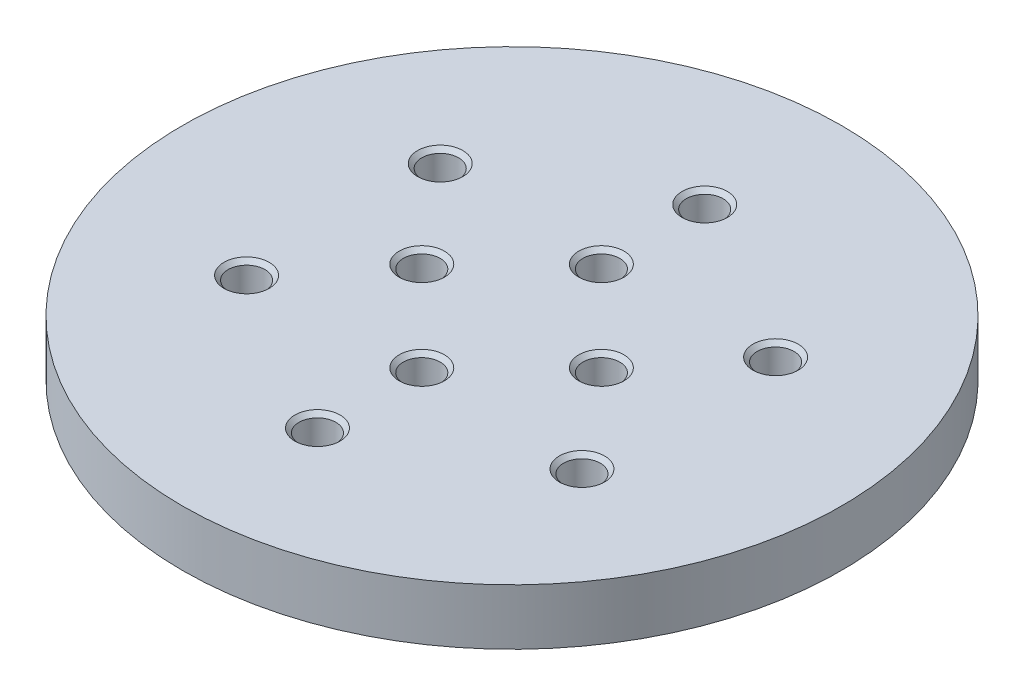
ISO-10303-21;
HEADER;
FILE_DESCRIPTION(('STEP AP214'),'2;1');
FILE_NAME('part.step','',(''),(''),'','','');
FILE_SCHEMA(('AUTOMOTIVE_DESIGN { 1 0 10303 214 1 1 1 1 }'));
ENDSEC;
DATA;
#1=APPLICATION_CONTEXT('core data for automotive mechanical design processes');
#2=APPLICATION_PROTOCOL_DEFINITION('international standard','automotive_design',2000,#1);
#3=PRODUCT_CONTEXT('',#1,'mechanical');
#4=PRODUCT('Part','Part','',(#3));
#5=PRODUCT_RELATED_PRODUCT_CATEGORY('part','',(#4));
#6=PRODUCT_DEFINITION_FORMATION('','',#4);
#7=PRODUCT_DEFINITION_CONTEXT('part definition',#1,'design');
#8=PRODUCT_DEFINITION('design','',#6,#7);
#9=PRODUCT_DEFINITION_SHAPE('','',#8);
#10=(LENGTH_UNIT() NAMED_UNIT(*) SI_UNIT(.MILLI.,.METRE.));
#11=(NAMED_UNIT(*) PLANE_ANGLE_UNIT() SI_UNIT($,.RADIAN.));
#12=(NAMED_UNIT(*) SI_UNIT($,.STERADIAN.) SOLID_ANGLE_UNIT());
#13=UNCERTAINTY_MEASURE_WITH_UNIT(LENGTH_MEASURE(1.E-05),#10,'distance_accuracy_value','');
#14=(GEOMETRIC_REPRESENTATION_CONTEXT(3) GLOBAL_UNCERTAINTY_ASSIGNED_CONTEXT((#13)) GLOBAL_UNIT_ASSIGNED_CONTEXT((#10,
#11,#12)) REPRESENTATION_CONTEXT('',''));
#15=CARTESIAN_POINT('',(0.,0.,0.));
#16=DIRECTION('',(0.,0.,1.));
#17=DIRECTION('',(1.,0.,0.));
#18=AXIS2_PLACEMENT_3D('',#15,#16,#17);
#19=CARTESIAN_POINT('',(0.,5.,0.));
#20=DIRECTION('',(0.,-1.,0.));
#21=DIRECTION('',(0.,0.,-1.));
#22=AXIS2_PLACEMENT_3D('',#19,#20,#21);
#23=CYLINDRICAL_SURFACE('',#22,29.5);
#24=CARTESIAN_POINT('',(0.,5.,0.));
#25=DIRECTION('',(0.,1.,0.));
#26=DIRECTION('',(0.,0.,1.));
#27=AXIS2_PLACEMENT_3D('',#24,#25,#26);
#28=CIRCLE('',#27,29.5);
#29=CARTESIAN_POINT('',(0.,5.,29.5));
#30=VERTEX_POINT('',#29);
#31=EDGE_CURVE('E10',#30,#30,#28,.T.);
#32=ORIENTED_EDGE('',*,*,#31,.F.);
#33=EDGE_LOOP('',(#32));
#34=FACE_BOUND('',#33,.T.);
#35=CARTESIAN_POINT('',(0.,0.,0.));
#36=DIRECTION('',(0.,1.,0.));
#37=DIRECTION('',(0.,0.,1.));
#38=AXIS2_PLACEMENT_3D('',#35,#36,#37);
#39=CIRCLE('',#38,29.5);
#40=CARTESIAN_POINT('',(0.,0.,29.5));
#41=VERTEX_POINT('',#40);
#42=EDGE_CURVE('E50',#41,#41,#39,.T.);
#43=ORIENTED_EDGE('',*,*,#42,.T.);
#44=EDGE_LOOP('',(#43));
#45=FACE_BOUND('',#44,.T.);
#46=ADVANCED_FACE('F43',(#34,#45),#23,.T.);
#47=CARTESIAN_POINT('',(0.,5.,0.));
#48=DIRECTION('',(0.,1.,0.));
#49=DIRECTION('',(0.,0.,1.));
#50=AXIS2_PLACEMENT_3D('',#47,#48,#49);
#51=PLANE('',#50);
#52=CARTESIAN_POINT('',(15.010395937938,5.,-8.58374386458872));
#53=DIRECTION('',(0.,1.,0.));
#54=DIRECTION('',(0.,0.,1.));
#55=AXIS2_PLACEMENT_3D('',#52,#53,#54);
#56=CIRCLE('',#55,2.025);
#57=CARTESIAN_POINT('',(15.010395937938,5.,-6.55874386458872));
#58=VERTEX_POINT('',#57);
#59=EDGE_CURVE('E276',#58,#58,#56,.T.);
#60=ORIENTED_EDGE('',*,*,#59,.F.);
#61=EDGE_LOOP('',(#60));
#62=FACE_BOUND('',#61,.T.);
#63=CARTESIAN_POINT('',(15.0103959379382,5.,8.74876840623421));
#64=DIRECTION('',(0.,1.,0.));
#65=DIRECTION('',(0.,0.,1.));
#66=AXIS2_PLACEMENT_3D('',#63,#64,#65);
#67=CIRCLE('',#66,2.025);
#68=CARTESIAN_POINT('',(15.0103959379382,5.,10.7737684062342));
#69=VERTEX_POINT('',#68);
#70=EDGE_CURVE('E106',#69,#69,#67,.T.);
#71=ORIENTED_EDGE('',*,*,#70,.F.);
#72=EDGE_LOOP('',(#71));
#73=FACE_BOUND('',#72,.T.);
#74=CARTESIAN_POINT('',(0.,5.,17.4150245416458));
#75=DIRECTION('',(0.,1.,0.));
#76=DIRECTION('',(0.,0.,1.));
#77=AXIS2_PLACEMENT_3D('',#74,#75,#76);
#78=CIRCLE('',#77,2.025);
#79=CARTESIAN_POINT('',(0.,5.,19.4400245416458));
#80=VERTEX_POINT('',#79);
#81=EDGE_CURVE('E99',#80,#80,#78,.T.);
#82=ORIENTED_EDGE('',*,*,#81,.F.);
#83=EDGE_LOOP('',(#82));
#84=FACE_BOUND('',#83,.T.);
#85=CARTESIAN_POINT('',(-15.0103959379381,5.,8.74876840623443));
#86=DIRECTION('',(0.,1.,0.));
#87=DIRECTION('',(0.,0.,1.));
#88=AXIS2_PLACEMENT_3D('',#85,#86,#87);
#89=CIRCLE('',#88,2.025);
#90=CARTESIAN_POINT('',(-15.0103959379381,5.,10.7737684062344));
#91=VERTEX_POINT('',#90);
#92=EDGE_CURVE('E95',#91,#91,#89,.T.);
#93=ORIENTED_EDGE('',*,*,#92,.F.);
#94=EDGE_LOOP('',(#93));
#95=FACE_BOUND('',#94,.T.);
#96=CARTESIAN_POINT('',(-15.0103959379382,5.,-8.58374386458851));
#97=DIRECTION('',(0.,1.,0.));
#98=DIRECTION('',(0.,0.,1.));
#99=AXIS2_PLACEMENT_3D('',#96,#97,#98);
#100=CIRCLE('',#99,2.025);
#101=CARTESIAN_POINT('',(-15.0103959379382,5.,-6.55874386458852));
#102=VERTEX_POINT('',#101);
#103=EDGE_CURVE('E91',#102,#102,#100,.T.);
#104=ORIENTED_EDGE('',*,*,#103,.F.);
#105=EDGE_LOOP('',(#104));
#106=FACE_BOUND('',#105,.T.);
#107=CARTESIAN_POINT('',(0.,5.,-17.25));
#108=DIRECTION('',(0.,1.,0.));
#109=DIRECTION('',(0.,0.,1.));
#110=AXIS2_PLACEMENT_3D('',#107,#108,#109);
#111=CIRCLE('',#110,2.025);
#112=CARTESIAN_POINT('',(0.,5.,-15.225));
#113=VERTEX_POINT('',#112);
#114=EDGE_CURVE('E86',#113,#113,#111,.T.);
#115=ORIENTED_EDGE('',*,*,#114,.F.);
#116=EDGE_LOOP('',(#115));
#117=FACE_BOUND('',#116,.T.);
#118=CARTESIAN_POINT('',(8.03787452943668,5.,0.0378745294365963));
#119=DIRECTION('',(0.,1.,0.));
#120=DIRECTION('',(0.,0.,1.));
#121=AXIS2_PLACEMENT_3D('',#118,#119,#120);
#122=CIRCLE('',#121,2.025);
#123=CARTESIAN_POINT('',(8.03787452943668,5.,2.0628745294366));
#124=VERTEX_POINT('',#123);
#125=EDGE_CURVE('E81',#124,#124,#122,.T.);
#126=ORIENTED_EDGE('',*,*,#125,.F.);
#127=EDGE_LOOP('',(#126));
#128=FACE_BOUND('',#127,.T.);
#129=CARTESIAN_POINT('',(0.,5.,8.07574905887336));
#130=DIRECTION('',(0.,1.,0.));
#131=DIRECTION('',(0.,0.,1.));
#132=AXIS2_PLACEMENT_3D('',#129,#130,#131);
#133=CIRCLE('',#132,2.025);
#134=CARTESIAN_POINT('',(0.,5.,10.1007490588734));
#135=VERTEX_POINT('',#134);
#136=EDGE_CURVE('E76',#135,#135,#133,.T.);
#137=ORIENTED_EDGE('',*,*,#136,.F.);
#138=EDGE_LOOP('',(#137));
#139=FACE_BOUND('',#138,.T.);
#140=CARTESIAN_POINT('',(-8.03787452943668,5.,0.0378745294367086));
#141=DIRECTION('',(0.,1.,0.));
#142=DIRECTION('',(0.,0.,1.));
#143=AXIS2_PLACEMENT_3D('',#140,#141,#142);
#144=CIRCLE('',#143,2.025);
#145=CARTESIAN_POINT('',(-8.03787452943668,5.,2.06287452943671));
#146=VERTEX_POINT('',#145);
#147=EDGE_CURVE('E71',#146,#146,#144,.T.);
#148=ORIENTED_EDGE('',*,*,#147,.F.);
#149=EDGE_LOOP('',(#148));
#150=FACE_BOUND('',#149,.T.);
#151=CARTESIAN_POINT('',(0.,5.,-8.));
#152=DIRECTION('',(0.,1.,0.));
#153=DIRECTION('',(0.,0.,1.));
#154=AXIS2_PLACEMENT_3D('',#151,#152,#153);
#155=CIRCLE('',#154,2.025);
#156=CARTESIAN_POINT('',(0.,5.,-5.975));
#157=VERTEX_POINT('',#156);
#158=EDGE_CURVE('E66',#157,#157,#155,.T.);
#159=ORIENTED_EDGE('',*,*,#158,.F.);
#160=EDGE_LOOP('',(#159));
#161=FACE_BOUND('',#160,.T.);
#162=ORIENTED_EDGE('',*,*,#31,.T.);
#163=EDGE_LOOP('',(#162));
#164=FACE_BOUND('',#163,.T.);
#165=ADVANCED_FACE('F164',(#62,#73,#84,#95,#106,#117,#128,#139,#150,#161,#164),#51,.T.);
#166=CARTESIAN_POINT('',(0.,0.,0.));
#167=DIRECTION('',(0.,1.,0.));
#168=DIRECTION('',(0.,0.,1.));
#169=AXIS2_PLACEMENT_3D('',#166,#167,#168);
#170=PLANE('',#169);
#171=CARTESIAN_POINT('',(15.010395937938,0.,-8.58374386458872));
#172=DIRECTION('',(0.,1.,0.));
#173=DIRECTION('',(0.,0.,1.));
#174=AXIS2_PLACEMENT_3D('',#171,#172,#173);
#175=CIRCLE('',#174,1.64999999999999);
#176=CARTESIAN_POINT('',(15.010395937938,0.,-6.93374386458874));
#177=VERTEX_POINT('',#176);
#178=EDGE_CURVE('E46',#177,#177,#175,.T.);
#179=ORIENTED_EDGE('',*,*,#178,.T.);
#180=EDGE_LOOP('',(#179));
#181=FACE_BOUND('',#180,.T.);
#182=CARTESIAN_POINT('',(15.0103959379382,0.,8.74876840623421));
#183=DIRECTION('',(0.,1.,0.));
#184=DIRECTION('',(0.,0.,1.));
#185=AXIS2_PLACEMENT_3D('',#182,#183,#184);
#186=CIRCLE('',#185,1.64999999999999);
#187=CARTESIAN_POINT('',(15.0103959379382,0.,10.3987684062342));
#188=VERTEX_POINT('',#187);
#189=EDGE_CURVE('E97',#188,#188,#186,.T.);
#190=ORIENTED_EDGE('',*,*,#189,.T.);
#191=EDGE_LOOP('',(#190));
#192=FACE_BOUND('',#191,.T.);
#193=CARTESIAN_POINT('',(0.,0.,17.4150245416458));
#194=DIRECTION('',(0.,1.,0.));
#195=DIRECTION('',(0.,0.,1.));
#196=AXIS2_PLACEMENT_3D('',#193,#194,#195);
#197=CIRCLE('',#196,1.64999999999999);
#198=CARTESIAN_POINT('',(0.,0.,19.0650245416458));
#199=VERTEX_POINT('',#198);
#200=EDGE_CURVE('E93',#199,#199,#197,.T.);
#201=ORIENTED_EDGE('',*,*,#200,.T.);
#202=EDGE_LOOP('',(#201));
#203=FACE_BOUND('',#202,.T.);
#204=CARTESIAN_POINT('',(-15.0103959379381,0.,8.74876840623443));
#205=DIRECTION('',(0.,1.,0.));
#206=DIRECTION('',(0.,0.,1.));
#207=AXIS2_PLACEMENT_3D('',#204,#205,#206);
#208=CIRCLE('',#207,1.64999999999999);
#209=CARTESIAN_POINT('',(-15.0103959379381,0.,10.3987684062344));
#210=VERTEX_POINT('',#209);
#211=EDGE_CURVE('E88',#210,#210,#208,.T.);
#212=ORIENTED_EDGE('',*,*,#211,.T.);
#213=EDGE_LOOP('',(#212));
#214=FACE_BOUND('',#213,.T.);
#215=CARTESIAN_POINT('',(-15.0103959379382,0.,-8.58374386458851));
#216=DIRECTION('',(0.,1.,0.));
#217=DIRECTION('',(0.,0.,1.));
#218=AXIS2_PLACEMENT_3D('',#215,#216,#217);
#219=CIRCLE('',#218,1.64999999999999);
#220=CARTESIAN_POINT('',(-15.0103959379382,0.,-6.93374386458853));
#221=VERTEX_POINT('',#220);
#222=EDGE_CURVE('E83',#221,#221,#219,.T.);
#223=ORIENTED_EDGE('',*,*,#222,.T.);
#224=EDGE_LOOP('',(#223));
#225=FACE_BOUND('',#224,.T.);
#226=CARTESIAN_POINT('',(0.,0.,-17.25));
#227=DIRECTION('',(0.,1.,0.));
#228=DIRECTION('',(0.,0.,1.));
#229=AXIS2_PLACEMENT_3D('',#226,#227,#228);
#230=CIRCLE('',#229,1.64999999999999);
#231=CARTESIAN_POINT('',(0.,0.,-15.6));
#232=VERTEX_POINT('',#231);
#233=EDGE_CURVE('E78',#232,#232,#230,.T.);
#234=ORIENTED_EDGE('',*,*,#233,.T.);
#235=EDGE_LOOP('',(#234));
#236=FACE_BOUND('',#235,.T.);
#237=CARTESIAN_POINT('',(8.03787452943668,0.,0.0378745294365963));
#238=DIRECTION('',(0.,1.,0.));
#239=DIRECTION('',(0.,0.,1.));
#240=AXIS2_PLACEMENT_3D('',#237,#238,#239);
#241=CIRCLE('',#240,1.64999999999999);
#242=CARTESIAN_POINT('',(8.03787452943668,0.,1.68787452943659));
#243=VERTEX_POINT('',#242);
#244=EDGE_CURVE('E73',#243,#243,#241,.T.);
#245=ORIENTED_EDGE('',*,*,#244,.T.);
#246=EDGE_LOOP('',(#245));
#247=FACE_BOUND('',#246,.T.);
#248=CARTESIAN_POINT('',(0.,0.,8.07574905887336));
#249=DIRECTION('',(0.,1.,0.));
#250=DIRECTION('',(0.,0.,1.));
#251=AXIS2_PLACEMENT_3D('',#248,#249,#250);
#252=CIRCLE('',#251,1.64999999999999);
#253=CARTESIAN_POINT('',(0.,0.,9.72574905887335));
#254=VERTEX_POINT('',#253);
#255=EDGE_CURVE('E68',#254,#254,#252,.T.);
#256=ORIENTED_EDGE('',*,*,#255,.T.);
#257=EDGE_LOOP('',(#256));
#258=FACE_BOUND('',#257,.T.);
#259=CARTESIAN_POINT('',(-8.03787452943668,0.,0.0378745294367086));
#260=DIRECTION('',(0.,1.,0.));
#261=DIRECTION('',(0.,0.,1.));
#262=AXIS2_PLACEMENT_3D('',#259,#260,#261);
#263=CIRCLE('',#262,1.64999999999999);
#264=CARTESIAN_POINT('',(-8.03787452943668,0.,1.6878745294367));
#265=VERTEX_POINT('',#264);
#266=EDGE_CURVE('E63',#265,#265,#263,.T.);
#267=ORIENTED_EDGE('',*,*,#266,.T.);
#268=EDGE_LOOP('',(#267));
#269=FACE_BOUND('',#268,.T.);
#270=CARTESIAN_POINT('',(0.,0.,-8.));
#271=DIRECTION('',(0.,1.,0.));
#272=DIRECTION('',(0.,0.,1.));
#273=AXIS2_PLACEMENT_3D('',#270,#271,#272);
#274=CIRCLE('',#273,1.64999999999999);
#275=CARTESIAN_POINT('',(0.,0.,-6.35000000000001));
#276=VERTEX_POINT('',#275);
#277=EDGE_CURVE('E55',#276,#276,#274,.T.);
#278=ORIENTED_EDGE('',*,*,#277,.T.);
#279=EDGE_LOOP('',(#278));
#280=FACE_BOUND('',#279,.T.);
#281=ORIENTED_EDGE('',*,*,#42,.F.);
#282=EDGE_LOOP('',(#281));
#283=FACE_BOUND('',#282,.T.);
#284=ADVANCED_FACE('F161',(#181,#192,#203,#214,#225,#236,#247,#258,#269,#280,#283),#170,.F.);
#285=CARTESIAN_POINT('',(0.,5.,-8.));
#286=DIRECTION('',(0.,1.,0.));
#287=DIRECTION('',(0.,0.,1.));
#288=AXIS2_PLACEMENT_3D('',#285,#286,#287);
#289=CYLINDRICAL_SURFACE('',#288,1.64999999999999);
#290=CARTESIAN_POINT('',(0.,4.625,-8.));
#291=DIRECTION('',(0.,1.,0.));
#292=DIRECTION('',(0.,0.,1.));
#293=AXIS2_PLACEMENT_3D('',#290,#291,#292);
#294=CIRCLE('',#293,1.65);
#295=CARTESIAN_POINT('',(0.,4.625,-6.35));
#296=VERTEX_POINT('',#295);
#297=EDGE_CURVE('E58',#296,#296,#294,.T.);
#298=ORIENTED_EDGE('',*,*,#297,.T.);
#299=EDGE_LOOP('',(#298));
#300=FACE_BOUND('',#299,.T.);
#301=ORIENTED_EDGE('',*,*,#277,.F.);
#302=EDGE_LOOP('',(#301));
#303=FACE_BOUND('',#302,.T.);
#304=ADVANCED_FACE('F145',(#300,#303),#289,.F.);
#305=CARTESIAN_POINT('',(0.,5.,-8.));
#306=DIRECTION('',(0.,1.,0.));
#307=DIRECTION('',(0.,0.,1.));
#308=AXIS2_PLACEMENT_3D('',#305,#306,#307);
#309=CONICAL_SURFACE('',#308,2.025,0.785398163397446);
#310=ORIENTED_EDGE('',*,*,#297,.F.);
#311=EDGE_LOOP('',(#310));
#312=FACE_BOUND('',#311,.T.);
#313=ORIENTED_EDGE('',*,*,#158,.T.);
#314=EDGE_LOOP('',(#313));
#315=FACE_BOUND('',#314,.T.);
#316=ADVANCED_FACE('F148',(#312,#315),#309,.F.);
#317=CARTESIAN_POINT('',(-8.03787452943668,5.,0.0378745294367086));
#318=DIRECTION('',(0.,1.,0.));
#319=DIRECTION('',(0.,0.,1.));
#320=AXIS2_PLACEMENT_3D('',#317,#318,#319);
#321=CYLINDRICAL_SURFACE('',#320,1.64999999999999);
#322=CARTESIAN_POINT('',(-8.03787452943668,4.625,0.0378745294367086));
#323=DIRECTION('',(0.,1.,0.));
#324=DIRECTION('',(0.,0.,1.));
#325=AXIS2_PLACEMENT_3D('',#322,#323,#324);
#326=CIRCLE('',#325,1.65);
#327=CARTESIAN_POINT('',(-8.03787452943668,4.625,1.68787452943671));
#328=VERTEX_POINT('',#327);
#329=EDGE_CURVE('E67',#328,#328,#326,.T.);
#330=ORIENTED_EDGE('',*,*,#329,.T.);
#331=EDGE_LOOP('',(#330));
#332=FACE_BOUND('',#331,.T.);
#333=ORIENTED_EDGE('',*,*,#266,.F.);
#334=EDGE_LOOP('',(#333));
#335=FACE_BOUND('',#334,.T.);
#336=ADVANCED_FACE('F150',(#332,#335),#321,.F.);
#337=CARTESIAN_POINT('',(-8.03787452943668,5.,0.0378745294367086));
#338=DIRECTION('',(0.,1.,0.));
#339=DIRECTION('',(0.,0.,1.));
#340=AXIS2_PLACEMENT_3D('',#337,#338,#339);
#341=CONICAL_SURFACE('',#340,2.025,0.785398163397446);
#342=ORIENTED_EDGE('',*,*,#329,.F.);
#343=EDGE_LOOP('',(#342));
#344=FACE_BOUND('',#343,.T.);
#345=ORIENTED_EDGE('',*,*,#147,.T.);
#346=EDGE_LOOP('',(#345));
#347=FACE_BOUND('',#346,.T.);
#348=ADVANCED_FACE('F157',(#344,#347),#341,.F.);
#349=CARTESIAN_POINT('',(0.,5.,8.07574905887336));
#350=DIRECTION('',(0.,1.,0.));
#351=DIRECTION('',(0.,0.,1.));
#352=AXIS2_PLACEMENT_3D('',#349,#350,#351);
#353=CYLINDRICAL_SURFACE('',#352,1.64999999999999);
#354=CARTESIAN_POINT('',(0.,4.625,8.07574905887336));
#355=DIRECTION('',(0.,1.,0.));
#356=DIRECTION('',(0.,0.,1.));
#357=AXIS2_PLACEMENT_3D('',#354,#355,#356);
#358=CIRCLE('',#357,1.65);
#359=CARTESIAN_POINT('',(0.,4.625,9.72574905887336));
#360=VERTEX_POINT('',#359);
#361=EDGE_CURVE('E72',#360,#360,#358,.T.);
#362=ORIENTED_EDGE('',*,*,#361,.T.);
#363=EDGE_LOOP('',(#362));
#364=FACE_BOUND('',#363,.T.);
#365=ORIENTED_EDGE('',*,*,#255,.F.);
#366=EDGE_LOOP('',(#365));
#367=FACE_BOUND('',#366,.T.);
#368=ADVANCED_FACE('F199',(#364,#367),#353,.F.);
#369=CARTESIAN_POINT('',(0.,5.,8.07574905887336));
#370=DIRECTION('',(0.,1.,0.));
#371=DIRECTION('',(0.,0.,1.));
#372=AXIS2_PLACEMENT_3D('',#369,#370,#371);
#373=CONICAL_SURFACE('',#372,2.025,0.785398163397446);
#374=ORIENTED_EDGE('',*,*,#361,.F.);
#375=EDGE_LOOP('',(#374));
#376=FACE_BOUND('',#375,.T.);
#377=ORIENTED_EDGE('',*,*,#136,.T.);
#378=EDGE_LOOP('',(#377));
#379=FACE_BOUND('',#378,.T.);
#380=ADVANCED_FACE('F201',(#376,#379),#373,.F.);
#381=CARTESIAN_POINT('',(8.03787452943668,5.,0.0378745294365963));
#382=DIRECTION('',(0.,1.,0.));
#383=DIRECTION('',(0.,0.,1.));
#384=AXIS2_PLACEMENT_3D('',#381,#382,#383);
#385=CYLINDRICAL_SURFACE('',#384,1.64999999999999);
#386=CARTESIAN_POINT('',(8.03787452943668,4.625,0.0378745294365963));
#387=DIRECTION('',(0.,1.,0.));
#388=DIRECTION('',(0.,0.,1.));
#389=AXIS2_PLACEMENT_3D('',#386,#387,#388);
#390=CIRCLE('',#389,1.65);
#391=CARTESIAN_POINT('',(8.03787452943668,4.625,1.6878745294366));
#392=VERTEX_POINT('',#391);
#393=EDGE_CURVE('E77',#392,#392,#390,.T.);
#394=ORIENTED_EDGE('',*,*,#393,.T.);
#395=EDGE_LOOP('',(#394));
#396=FACE_BOUND('',#395,.T.);
#397=ORIENTED_EDGE('',*,*,#244,.F.);
#398=EDGE_LOOP('',(#397));
#399=FACE_BOUND('',#398,.T.);
#400=ADVANCED_FACE('F208',(#396,#399),#385,.F.);
#401=CARTESIAN_POINT('',(8.03787452943668,5.,0.0378745294365963));
#402=DIRECTION('',(0.,1.,0.));
#403=DIRECTION('',(0.,0.,1.));
#404=AXIS2_PLACEMENT_3D('',#401,#402,#403);
#405=CONICAL_SURFACE('',#404,2.025,0.785398163397446);
#406=ORIENTED_EDGE('',*,*,#393,.F.);
#407=EDGE_LOOP('',(#406));
#408=FACE_BOUND('',#407,.T.);
#409=ORIENTED_EDGE('',*,*,#125,.T.);
#410=EDGE_LOOP('',(#409));
#411=FACE_BOUND('',#410,.T.);
#412=ADVANCED_FACE('F216',(#408,#411),#405,.F.);
#413=CARTESIAN_POINT('',(0.,5.,-17.25));
#414=DIRECTION('',(0.,1.,0.));
#415=DIRECTION('',(0.,0.,1.));
#416=AXIS2_PLACEMENT_3D('',#413,#414,#415);
#417=CYLINDRICAL_SURFACE('',#416,1.64999999999999);
#418=CARTESIAN_POINT('',(0.,4.625,-17.25));
#419=DIRECTION('',(0.,1.,0.));
#420=DIRECTION('',(0.,0.,1.));
#421=AXIS2_PLACEMENT_3D('',#418,#419,#420);
#422=CIRCLE('',#421,1.64999999999999);
#423=CARTESIAN_POINT('',(0.,4.625,-15.6));
#424=VERTEX_POINT('',#423);
#425=EDGE_CURVE('E82',#424,#424,#422,.T.);
#426=ORIENTED_EDGE('',*,*,#425,.T.);
#427=EDGE_LOOP('',(#426));
#428=FACE_BOUND('',#427,.T.);
#429=ORIENTED_EDGE('',*,*,#233,.F.);
#430=EDGE_LOOP('',(#429));
#431=FACE_BOUND('',#430,.T.);
#432=ADVANCED_FACE('F220',(#428,#431),#417,.F.);
#433=CARTESIAN_POINT('',(0.,5.,-17.25));
#434=DIRECTION('',(0.,1.,0.));
#435=DIRECTION('',(0.,0.,1.));
#436=AXIS2_PLACEMENT_3D('',#433,#434,#435);
#437=CONICAL_SURFACE('',#436,2.025,0.785398163397458);
#438=ORIENTED_EDGE('',*,*,#425,.F.);
#439=EDGE_LOOP('',(#438));
#440=FACE_BOUND('',#439,.T.);
#441=ORIENTED_EDGE('',*,*,#114,.T.);
#442=EDGE_LOOP('',(#441));
#443=FACE_BOUND('',#442,.T.);
#444=ADVANCED_FACE('F224',(#440,#443),#437,.F.);
#445=CARTESIAN_POINT('',(-15.0103959379382,5.,-8.58374386458851));
#446=DIRECTION('',(0.,1.,0.));
#447=DIRECTION('',(0.,0.,1.));
#448=AXIS2_PLACEMENT_3D('',#445,#446,#447);
#449=CYLINDRICAL_SURFACE('',#448,1.64999999999999);
#450=CARTESIAN_POINT('',(-15.0103959379382,4.625,-8.58374386458851));
#451=DIRECTION('',(0.,1.,0.));
#452=DIRECTION('',(0.,0.,1.));
#453=AXIS2_PLACEMENT_3D('',#450,#451,#452);
#454=CIRCLE('',#453,1.64999999999999);
#455=CARTESIAN_POINT('',(-15.0103959379382,4.625,-6.93374386458852));
#456=VERTEX_POINT('',#455);
#457=EDGE_CURVE('E87',#456,#456,#454,.T.);
#458=ORIENTED_EDGE('',*,*,#457,.T.);
#459=EDGE_LOOP('',(#458));
#460=FACE_BOUND('',#459,.T.);
#461=ORIENTED_EDGE('',*,*,#222,.F.);
#462=EDGE_LOOP('',(#461));
#463=FACE_BOUND('',#462,.T.);
#464=ADVANCED_FACE('F228',(#460,#463),#449,.F.);
#465=CARTESIAN_POINT('',(-15.0103959379382,5.,-8.58374386458851));
#466=DIRECTION('',(0.,1.,0.));
#467=DIRECTION('',(0.,0.,1.));
#468=AXIS2_PLACEMENT_3D('',#465,#466,#467);
#469=CONICAL_SURFACE('',#468,2.025,0.785398163397458);
#470=ORIENTED_EDGE('',*,*,#457,.F.);
#471=EDGE_LOOP('',(#470));
#472=FACE_BOUND('',#471,.T.);
#473=ORIENTED_EDGE('',*,*,#103,.T.);
#474=EDGE_LOOP('',(#473));
#475=FACE_BOUND('',#474,.T.);
#476=ADVANCED_FACE('F232',(#472,#475),#469,.F.);
#477=CARTESIAN_POINT('',(-15.0103959379381,5.,8.74876840623443));
#478=DIRECTION('',(0.,1.,0.));
#479=DIRECTION('',(0.,0.,1.));
#480=AXIS2_PLACEMENT_3D('',#477,#478,#479);
#481=CYLINDRICAL_SURFACE('',#480,1.64999999999999);
#482=CARTESIAN_POINT('',(-15.0103959379381,4.625,8.74876840623443));
#483=DIRECTION('',(0.,1.,0.));
#484=DIRECTION('',(0.,0.,1.));
#485=AXIS2_PLACEMENT_3D('',#482,#483,#484);
#486=CIRCLE('',#485,1.64999999999999);
#487=CARTESIAN_POINT('',(-15.0103959379381,4.625,10.3987684062344));
#488=VERTEX_POINT('',#487);
#489=EDGE_CURVE('E92',#488,#488,#486,.T.);
#490=ORIENTED_EDGE('',*,*,#489,.T.);
#491=EDGE_LOOP('',(#490));
#492=FACE_BOUND('',#491,.T.);
#493=ORIENTED_EDGE('',*,*,#211,.F.);
#494=EDGE_LOOP('',(#493));
#495=FACE_BOUND('',#494,.T.);
#496=ADVANCED_FACE('F236',(#492,#495),#481,.F.);
#497=CARTESIAN_POINT('',(-15.0103959379381,5.,8.74876840623443));
#498=DIRECTION('',(0.,1.,0.));
#499=DIRECTION('',(0.,0.,1.));
#500=AXIS2_PLACEMENT_3D('',#497,#498,#499);
#501=CONICAL_SURFACE('',#500,2.025,0.785398163397458);
#502=ORIENTED_EDGE('',*,*,#489,.F.);
#503=EDGE_LOOP('',(#502));
#504=FACE_BOUND('',#503,.T.);
#505=ORIENTED_EDGE('',*,*,#92,.T.);
#506=EDGE_LOOP('',(#505));
#507=FACE_BOUND('',#506,.T.);
#508=ADVANCED_FACE('F240',(#504,#507),#501,.F.);
#509=CARTESIAN_POINT('',(0.,5.,17.4150245416458));
#510=DIRECTION('',(0.,1.,0.));
#511=DIRECTION('',(0.,0.,1.));
#512=AXIS2_PLACEMENT_3D('',#509,#510,#511);
#513=CYLINDRICAL_SURFACE('',#512,1.64999999999999);
#514=CARTESIAN_POINT('',(0.,4.625,17.4150245416458));
#515=DIRECTION('',(0.,1.,0.));
#516=DIRECTION('',(0.,0.,1.));
#517=AXIS2_PLACEMENT_3D('',#514,#515,#516);
#518=CIRCLE('',#517,1.64999999999999);
#519=CARTESIAN_POINT('',(0.,4.625,19.0650245416458));
#520=VERTEX_POINT('',#519);
#521=EDGE_CURVE('E96',#520,#520,#518,.T.);
#522=ORIENTED_EDGE('',*,*,#521,.T.);
#523=EDGE_LOOP('',(#522));
#524=FACE_BOUND('',#523,.T.);
#525=ORIENTED_EDGE('',*,*,#200,.F.);
#526=EDGE_LOOP('',(#525));
#527=FACE_BOUND('',#526,.T.);
#528=ADVANCED_FACE('F244',(#524,#527),#513,.F.);
#529=CARTESIAN_POINT('',(0.,5.,17.4150245416458));
#530=DIRECTION('',(0.,1.,0.));
#531=DIRECTION('',(0.,0.,1.));
#532=AXIS2_PLACEMENT_3D('',#529,#530,#531);
#533=CONICAL_SURFACE('',#532,2.025,0.785398163397458);
#534=ORIENTED_EDGE('',*,*,#521,.F.);
#535=EDGE_LOOP('',(#534));
#536=FACE_BOUND('',#535,.T.);
#537=ORIENTED_EDGE('',*,*,#81,.T.);
#538=EDGE_LOOP('',(#537));
#539=FACE_BOUND('',#538,.T.);
#540=ADVANCED_FACE('F248',(#536,#539),#533,.F.);
#541=CARTESIAN_POINT('',(15.0103959379382,5.,8.74876840623421));
#542=DIRECTION('',(0.,1.,0.));
#543=DIRECTION('',(0.,0.,1.));
#544=AXIS2_PLACEMENT_3D('',#541,#542,#543);
#545=CYLINDRICAL_SURFACE('',#544,1.64999999999999);
#546=CARTESIAN_POINT('',(15.0103959379382,4.625,8.74876840623421));
#547=DIRECTION('',(0.,1.,0.));
#548=DIRECTION('',(0.,0.,1.));
#549=AXIS2_PLACEMENT_3D('',#546,#547,#548);
#550=CIRCLE('',#549,1.64999999999999);
#551=CARTESIAN_POINT('',(15.0103959379382,4.625,10.3987684062342));
#552=VERTEX_POINT('',#551);
#553=EDGE_CURVE('E100',#552,#552,#550,.T.);
#554=ORIENTED_EDGE('',*,*,#553,.T.);
#555=EDGE_LOOP('',(#554));
#556=FACE_BOUND('',#555,.T.);
#557=ORIENTED_EDGE('',*,*,#189,.F.);
#558=EDGE_LOOP('',(#557));
#559=FACE_BOUND('',#558,.T.);
#560=ADVANCED_FACE('F252',(#556,#559),#545,.F.);
#561=CARTESIAN_POINT('',(15.0103959379382,5.,8.74876840623421));
#562=DIRECTION('',(0.,1.,0.));
#563=DIRECTION('',(0.,0.,1.));
#564=AXIS2_PLACEMENT_3D('',#561,#562,#563);
#565=CONICAL_SURFACE('',#564,2.025,0.785398163397455);
#566=ORIENTED_EDGE('',*,*,#553,.F.);
#567=EDGE_LOOP('',(#566));
#568=FACE_BOUND('',#567,.T.);
#569=ORIENTED_EDGE('',*,*,#70,.T.);
#570=EDGE_LOOP('',(#569));
#571=FACE_BOUND('',#570,.T.);
#572=ADVANCED_FACE('F256',(#568,#571),#565,.F.);
#573=CARTESIAN_POINT('',(15.010395937938,5.,-8.58374386458872));
#574=DIRECTION('',(0.,1.,0.));
#575=DIRECTION('',(0.,0.,1.));
#576=AXIS2_PLACEMENT_3D('',#573,#574,#575);
#577=CYLINDRICAL_SURFACE('',#576,1.64999999999999);
#578=CARTESIAN_POINT('',(15.010395937938,4.625,-8.58374386458872));
#579=DIRECTION('',(0.,1.,0.));
#580=DIRECTION('',(0.,0.,1.));
#581=AXIS2_PLACEMENT_3D('',#578,#579,#580);
#582=CIRCLE('',#581,1.64999999999999);
#583=CARTESIAN_POINT('',(15.010395937938,4.625,-6.93374386458873));
#584=VERTEX_POINT('',#583);
#585=EDGE_CURVE('E273',#584,#584,#582,.T.);
#586=ORIENTED_EDGE('',*,*,#585,.T.);
#587=EDGE_LOOP('',(#586));
#588=FACE_BOUND('',#587,.T.);
#589=ORIENTED_EDGE('',*,*,#178,.F.);
#590=EDGE_LOOP('',(#589));
#591=FACE_BOUND('',#590,.T.);
#592=ADVANCED_FACE('F259',(#588,#591),#577,.F.);
#593=CARTESIAN_POINT('',(15.010395937938,5.,-8.58374386458872));
#594=DIRECTION('',(0.,1.,0.));
#595=DIRECTION('',(0.,0.,1.));
#596=AXIS2_PLACEMENT_3D('',#593,#594,#595);
#597=CONICAL_SURFACE('',#596,2.025,0.78539816339746);
#598=ORIENTED_EDGE('',*,*,#585,.F.);
#599=EDGE_LOOP('',(#598));
#600=FACE_BOUND('',#599,.T.);
#601=ORIENTED_EDGE('',*,*,#59,.T.);
#602=EDGE_LOOP('',(#601));
#603=FACE_BOUND('',#602,.T.);
#604=ADVANCED_FACE('F263',(#600,#603),#597,.F.);
#605=CLOSED_SHELL('',(#46,#165,#284,#304,#316,#336,#348,#368,#380,#400,#412,#432,#444,#464,#476,
#496,#508,#528,#540,#560,#572,#592,#604));
#606=MANIFOLD_SOLID_BREP('B2',#605);
#607=ADVANCED_BREP_SHAPE_REPRESENTATION('',(#18,#606),#14);
#608=SHAPE_DEFINITION_REPRESENTATION(#9,#607);
ENDSEC;
END-ISO-10303-21;
